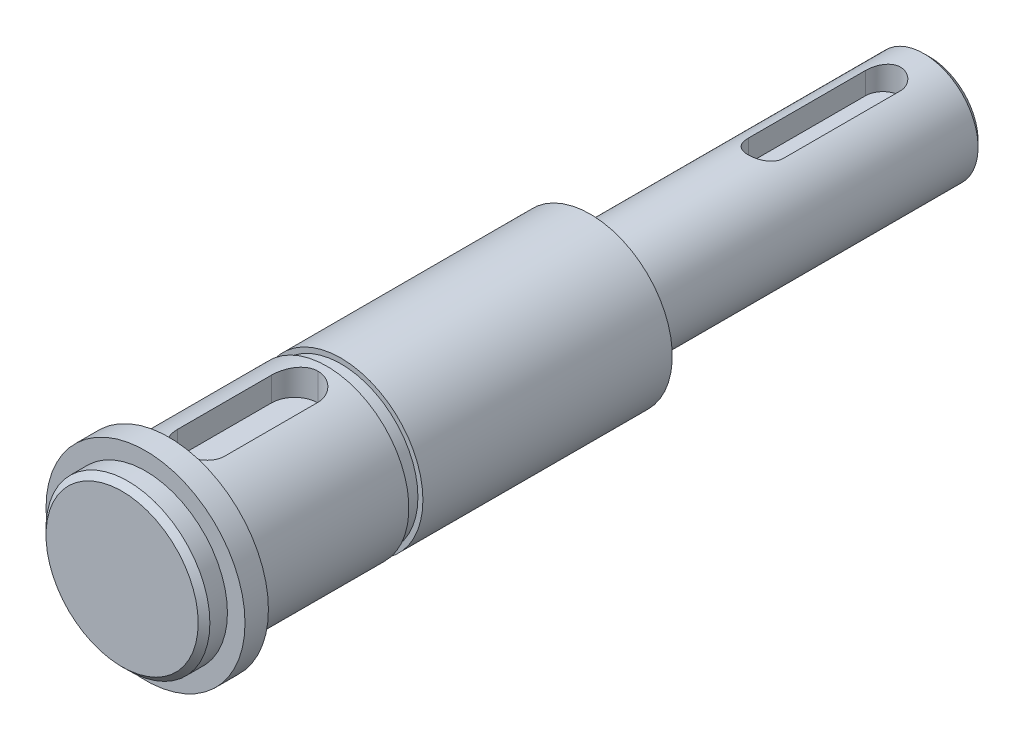
ISO-10303-21;
HEADER;
FILE_DESCRIPTION(('STEP AP214'),'2;1');
FILE_NAME('part.step','',(''),(''),'','','');
FILE_SCHEMA(('AUTOMOTIVE_DESIGN { 1 0 10303 214 1 1 1 1 }'));
ENDSEC;
DATA;
#1=APPLICATION_CONTEXT('core data for automotive mechanical design processes');
#2=APPLICATION_PROTOCOL_DEFINITION('international standard','automotive_design',2000,#1);
#3=PRODUCT_CONTEXT('',#1,'mechanical');
#4=PRODUCT('Part','Part','',(#3));
#5=PRODUCT_RELATED_PRODUCT_CATEGORY('part','',(#4));
#6=PRODUCT_DEFINITION_FORMATION('','',#4);
#7=PRODUCT_DEFINITION_CONTEXT('part definition',#1,'design');
#8=PRODUCT_DEFINITION('design','',#6,#7);
#9=PRODUCT_DEFINITION_SHAPE('','',#8);
#10=(LENGTH_UNIT() NAMED_UNIT(*) SI_UNIT(.MILLI.,.METRE.));
#11=(NAMED_UNIT(*) PLANE_ANGLE_UNIT() SI_UNIT($,.RADIAN.));
#12=(NAMED_UNIT(*) SI_UNIT($,.STERADIAN.) SOLID_ANGLE_UNIT());
#13=UNCERTAINTY_MEASURE_WITH_UNIT(LENGTH_MEASURE(1.E-05),#10,'distance_accuracy_value','');
#14=(GEOMETRIC_REPRESENTATION_CONTEXT(3) GLOBAL_UNCERTAINTY_ASSIGNED_CONTEXT((#13)) GLOBAL_UNIT_ASSIGNED_CONTEXT((#10,
#11,#12)) REPRESENTATION_CONTEXT('',''));
#15=CARTESIAN_POINT('',(0.,0.,0.));
#16=DIRECTION('',(0.,0.,1.));
#17=DIRECTION('',(1.,0.,0.));
#18=AXIS2_PLACEMENT_3D('',#15,#16,#17);
#19=CARTESIAN_POINT('',(0.,0.,-72.));
#20=DIRECTION('',(0.,0.,-1.));
#21=DIRECTION('',(-1.,0.,0.));
#22=AXIS2_PLACEMENT_3D('',#19,#20,#21);
#23=CYLINDRICAL_SURFACE('',#22,9.25);
#24=CARTESIAN_POINT('',(0.,0.,-129.));
#25=DIRECTION('',(0.,0.,-1.));
#26=DIRECTION('',(-1.,0.,0.));
#27=AXIS2_PLACEMENT_3D('',#24,#25,#26);
#28=CIRCLE('',#27,9.25);
#29=CARTESIAN_POINT('',(-9.25,0.,-129.));
#30=VERTEX_POINT('',#29);
#31=EDGE_CURVE('E279',#30,#30,#28,.F.);
#32=ORIENTED_EDGE('',*,*,#31,.T.);
#33=EDGE_LOOP('',(#32));
#34=FACE_BOUND('',#33,.T.);
#35=CARTESIAN_POINT('',(0.,0.,-72.));
#36=DIRECTION('',(0.,0.,-1.));
#37=DIRECTION('',(-1.,0.,0.));
#38=AXIS2_PLACEMENT_3D('',#35,#36,#37);
#39=CIRCLE('',#38,9.25);
#40=CARTESIAN_POINT('',(-9.25,0.,-72.));
#41=VERTEX_POINT('',#40);
#42=EDGE_CURVE('E135',#41,#41,#39,.T.);
#43=ORIENTED_EDGE('',*,*,#42,.T.);
#44=EDGE_LOOP('',(#43));
#45=FACE_BOUND('',#44,.T.);
#46=DIRECTION('',(0.,0.,-1.));
#47=VECTOR('',#46,1.);
#48=CARTESIAN_POINT('',(-2.99999999999999,8.75,-72.));
#49=LINE('',#48,#47);
#50=CARTESIAN_POINT('',(-3.,8.75,-102.));
#51=VERTEX_POINT('',#50);
#52=CARTESIAN_POINT('',(-3.,8.75,-122.));
#53=VERTEX_POINT('',#52);
#54=EDGE_CURVE('E58',#51,#53,#49,.T.);
#55=ORIENTED_EDGE('',*,*,#54,.T.);
#56=CARTESIAN_POINT('',(-3.,8.75,-122.));
#57=CARTESIAN_POINT('',(-3.00001064603914,8.74998738318087,-122.081985488388));
#58=CARTESIAN_POINT('',(-2.99663941357687,8.75115198392283,-122.16396388188));
#59=CARTESIAN_POINT('',(-2.98321609601522,8.75574174677567,-122.327287676229));
#60=CARTESIAN_POINT('',(-2.97316572871784,8.75916632764227,-122.408633234405));
#61=CARTESIAN_POINT('',(-2.94650479934562,8.7681694910523,-122.569886506345));
#62=CARTESIAN_POINT('',(-2.9299129094746,8.7737419416858,-122.649797641614));
#63=CARTESIAN_POINT('',(-2.89033684298874,8.78685864098524,-122.807834966268));
#64=CARTESIAN_POINT('',(-2.86735245354886,8.79440295529978,-122.88596109613));
#65=CARTESIAN_POINT('',(-2.78910942315085,8.8196603286256,-123.116778125584));
#66=CARTESIAN_POINT('',(-2.72452255370023,8.8400116071533,-123.266136986969));
#67=CARTESIAN_POINT('',(-2.57251268411809,8.88543387797246,-123.551915134394));
#68=CARTESIAN_POINT('',(-2.48507660937708,8.91050757018822,-123.688326950848));
#69=CARTESIAN_POINT('',(-2.2863897259887,8.9635831465424,-123.94941090532));
#70=CARTESIAN_POINT('',(-2.17444127219825,8.99165484526716,-124.073539025568));
#71=CARTESIAN_POINT('',(-1.93139892024592,9.04697249501885,-124.301626836327));
#72=CARTESIAN_POINT('',(-1.80030167229007,9.07421830055912,-124.405582990631));
#73=CARTESIAN_POINT('',(-1.51870540582056,9.12562242526545,-124.592837571217));
#74=CARTESIAN_POINT('',(-1.36780899056789,9.1496884927851,-124.675566005042));
#75=CARTESIAN_POINT('',(-1.05333489691852,9.19119649985878,-124.814248407804));
#76=CARTESIAN_POINT('',(-0.889760938434231,9.20864037373764,-124.87021019645));
#77=CARTESIAN_POINT('',(-0.560310334697045,9.23444300548374,-124.951930809957));
#78=CARTESIAN_POINT('',(-0.394688692266203,9.24308310957314,-124.978627173755));
#79=CARTESIAN_POINT('',(-0.0611031895520834,9.25130127521595,-125.004035591862));
#80=CARTESIAN_POINT('',(0.106860136438437,9.25088137120278,-125.002753928663));
#81=CARTESIAN_POINT('',(0.433735632232409,9.24121943359688,-124.972845935019));
#82=CARTESIAN_POINT('',(0.592752212310534,9.23230579961941,-124.945237469513));
#83=CARTESIAN_POINT('',(0.903757260455687,9.20706673314156,-124.865137681779));
#84=CARTESIAN_POINT('',(1.0557453428059,9.19074089439753,-124.812644995704));
#85=CARTESIAN_POINT('',(1.35066185941496,9.15208354689473,-124.683645454368));
#86=CARTESIAN_POINT('',(1.49344973066419,9.12967797082481,-124.60684034735));
#87=CARTESIAN_POINT('',(1.76441679515636,9.08120629438589,-124.431642133417));
#88=CARTESIAN_POINT('',(1.89259218634671,9.0551392452505,-124.333243427407));
#89=CARTESIAN_POINT('',(2.1367498105426,9.00073055671791,-124.112479640763));
#90=CARTESIAN_POINT('',(2.25193261579879,8.9723393235412,-123.989240971863));
#91=CARTESIAN_POINT('',(2.46026176566445,8.91746850535697,-123.724951286129));
#92=CARTESIAN_POINT('',(2.55340121916271,8.89098951994213,-123.58389472021));
#93=CARTESIAN_POINT('',(2.71607372822399,8.84266877234739,-123.285362516377));
#94=CARTESIAN_POINT('',(2.78527461089672,8.8208937238963,-123.127692615847));
#95=CARTESIAN_POINT('',(2.86816854221355,8.79414167919324,-122.883749462039));
#96=CARTESIAN_POINT('',(2.89231295965165,8.78621026484969,-122.801210017017));
#97=CARTESIAN_POINT('',(2.93345702936636,8.77255973856322,-122.634200742222));
#98=CARTESIAN_POINT('',(2.95045995286061,8.76683961381744,-122.549731815));
#99=CARTESIAN_POINT('',(2.97584110533728,8.75825542649653,-122.38783213584));
#100=CARTESIAN_POINT('',(2.9848988348786,8.75516720040972,-122.31051854789));
#101=CARTESIAN_POINT('',(2.99697814133517,8.75103592678231,-122.15547267636));
#102=CARTESIAN_POINT('',(3.00000784981102,8.7499901241289,-122.077741098846));
#103=CARTESIAN_POINT('',(3.,8.75,-122.));
#104=B_SPLINE_CURVE_WITH_KNOTS('',3,(#56,#57,#58,#59,#60,#61,#62,#63,#64,#65,#66,#67,#68,#69,
#70,#71,#72,#73,#74,#75,#76,#77,#78,#79,#80,#81,#82,#83,#84,#85,#86,#87,#88,#89,#90,#91,#92,#93,
#94,#95,#96,#97,#98,#99,#100,#101,#102,#103),.UNSPECIFIED.,.F.,.F.,(4,2,2,2,2,2,2,2,2,2,2,2,2,2,
2,2,2,2,2,2,2,2,2,4),(0.,0.245866897540807,0.491670585206091,0.736777669242226,
0.981892914588718,1.4714334338179,1.96125469015316,2.46742979664977,2.97369355716503,
3.49238983848766,4.01093449324136,4.51233228252208,5.01361748362456,5.496275524058,
5.97896002091647,6.46781161234199,6.9567901102069,7.46759053136845,7.97855042676549,
8.49634001607234,8.75514687203685,9.0138350498512,9.24729007377515,9.48042996206578),.UNSPECIFIED.);
#105=CARTESIAN_POINT('',(3.,8.75,-122.));
#106=VERTEX_POINT('',#105);
#107=EDGE_CURVE('E12',#53,#106,#104,.T.);
#108=ORIENTED_EDGE('',*,*,#107,.T.);
#109=DIRECTION('',(0.,0.,-1.));
#110=VECTOR('',#109,1.);
#111=CARTESIAN_POINT('',(3.00000000000001,8.75,-72.));
#112=LINE('',#111,#110);
#113=CARTESIAN_POINT('',(3.00000000000001,8.75,-102.));
#114=VERTEX_POINT('',#113);
#115=EDGE_CURVE('E282',#106,#114,#112,.F.);
#116=ORIENTED_EDGE('',*,*,#115,.T.);
#117=CARTESIAN_POINT('',(3.,8.75,-102.));
#118=CARTESIAN_POINT('',(3.00001064603914,8.74998738318087,-101.918014511612));
#119=CARTESIAN_POINT('',(2.99663941357687,8.75115198392283,-101.83603611812));
#120=CARTESIAN_POINT('',(2.98321609601522,8.75574174677567,-101.672712323771));
#121=CARTESIAN_POINT('',(2.97316572871784,8.75916632764227,-101.591366765595));
#122=CARTESIAN_POINT('',(2.94650479934562,8.7681694910523,-101.430113493655));
#123=CARTESIAN_POINT('',(2.9299129094746,8.77374194168581,-101.350202358386));
#124=CARTESIAN_POINT('',(2.89033684298874,8.78685864098524,-101.192165033732));
#125=CARTESIAN_POINT('',(2.86735245354886,8.79440295529978,-101.11403890387));
#126=CARTESIAN_POINT('',(2.78910942315085,8.8196603286256,-100.883221874416));
#127=CARTESIAN_POINT('',(2.72452255370023,8.8400116071533,-100.733863013031));
#128=CARTESIAN_POINT('',(2.57251268411808,8.88543387797246,-100.448084865606));
#129=CARTESIAN_POINT('',(2.48507660937708,8.91050757018822,-100.311673049152));
#130=CARTESIAN_POINT('',(2.28638972598871,8.9635831465424,-100.05058909468));
#131=CARTESIAN_POINT('',(2.17444127219825,8.99165484526716,-99.9264609744317));
#132=CARTESIAN_POINT('',(1.93139892024593,9.04697249501885,-99.6983731636731));
#133=CARTESIAN_POINT('',(1.80030167229008,9.07421830055912,-99.5944170093692));
#134=CARTESIAN_POINT('',(1.51870540582056,9.12562242526545,-99.407162428783));
#135=CARTESIAN_POINT('',(1.36780899056789,9.1496884927851,-99.3244339949582));
#136=CARTESIAN_POINT('',(1.05333489691853,9.19119649985878,-99.1857515921959));
#137=CARTESIAN_POINT('',(0.889760938434239,9.20864037373764,-99.1297898035505));
#138=CARTESIAN_POINT('',(0.560310334697054,9.23444300548374,-99.0480691900426));
#139=CARTESIAN_POINT('',(0.394688692266212,9.24308310957314,-99.0213728262445));
#140=CARTESIAN_POINT('',(0.0611031895520905,9.25130127521595,-98.9959644081377));
#141=CARTESIAN_POINT('',(-0.106860136438431,9.25088137120279,-98.9972460713372));
#142=CARTESIAN_POINT('',(-0.433735632232404,9.24121943359688,-99.0271540649808));
#143=CARTESIAN_POINT('',(-0.59275221231053,9.23230579961941,-99.0547625304869));
#144=CARTESIAN_POINT('',(-0.903757260455683,9.20706673314156,-99.1348623182213));
#145=CARTESIAN_POINT('',(-1.0557453428059,9.19074089439753,-99.1873550042959));
#146=CARTESIAN_POINT('',(-1.35066185941496,9.15208354689473,-99.3163545456322));
#147=CARTESIAN_POINT('',(-1.49344973066418,9.12967797082481,-99.3931596526497));
#148=CARTESIAN_POINT('',(-1.76441679515636,9.08120629438589,-99.5683578665831));
#149=CARTESIAN_POINT('',(-1.89259218634671,9.05513924525051,-99.6667565725928));
#150=CARTESIAN_POINT('',(-2.1367498105426,9.00073055671791,-99.8875203592366));
#151=CARTESIAN_POINT('',(-2.25193261579879,8.9723393235412,-100.010759028137));
#152=CARTESIAN_POINT('',(-2.46026176566445,8.91746850535698,-100.275048713871));
#153=CARTESIAN_POINT('',(-2.55340121916271,8.89098951994213,-100.41610527979));
#154=CARTESIAN_POINT('',(-2.71607372822399,8.84266877234739,-100.714637483623));
#155=CARTESIAN_POINT('',(-2.78527461089672,8.82089372389631,-100.872307384153));
#156=CARTESIAN_POINT('',(-2.86816854221355,8.79414167919324,-101.116250537961));
#157=CARTESIAN_POINT('',(-2.89231295965165,8.78621026484969,-101.198789982983));
#158=CARTESIAN_POINT('',(-2.93345702936636,8.77255973856322,-101.365799257778));
#159=CARTESIAN_POINT('',(-2.9504599528606,8.76683961381744,-101.450268185));
#160=CARTESIAN_POINT('',(-2.97584110533728,8.75825542649653,-101.61216786416));
#161=CARTESIAN_POINT('',(-2.98489883487859,8.75516720040972,-101.68948145211));
#162=CARTESIAN_POINT('',(-2.99697814133517,8.75103592678231,-101.84452732364));
#163=CARTESIAN_POINT('',(-3.00000784981102,8.7499901241289,-101.922258901154));
#164=CARTESIAN_POINT('',(-3.,8.75,-102.));
#165=B_SPLINE_CURVE_WITH_KNOTS('',3,(#117,#118,#119,#120,#121,#122,#123,#124,#125,#126,#127,
#128,#129,#130,#131,#132,#133,#134,#135,#136,#137,#138,#139,#140,#141,#142,#143,#144,#145,#146,
#147,#148,#149,#150,#151,#152,#153,#154,#155,#156,#157,#158,#159,#160,#161,#162,#163,#164),
.UNSPECIFIED.,.F.,.F.,(4,2,2,2,2,2,2,2,2,2,2,2,2,2,2,2,2,2,2,2,2,2,2,4),(0.,0.245866897540793,
0.491670585206091,0.73677766924224,0.981892914588718,1.4714334338179,1.96125469015316,
2.46742979664976,2.97369355716503,3.49238983848766,4.01093449324135,4.51233228252207,
5.01361748362456,5.49627552405799,5.97896002091646,6.46781161234198,6.9567901102069,
7.46759053136844,7.97855042676548,8.49634001607235,8.75514687203686,9.0138350498512,
9.24729007377515,9.48042996206578),.UNSPECIFIED.);
#166=EDGE_CURVE('E285',#114,#51,#165,.T.);
#167=ORIENTED_EDGE('',*,*,#166,.T.);
#168=EDGE_LOOP('',(#55,#108,#116,#167));
#169=FACE_BOUND('',#168,.T.);
#170=ADVANCED_FACE('F44',(#34,#45,#169),#23,.T.);
#171=CARTESIAN_POINT('',(0.,0.,5.));
#172=DIRECTION('',(0.,0.,-1.));
#173=DIRECTION('',(-1.,0.,0.));
#174=AXIS2_PLACEMENT_3D('',#171,#172,#173);
#175=CYLINDRICAL_SURFACE('',#174,14.);
#176=CARTESIAN_POINT('',(0.,0.,-29.3972904594189));
#177=DIRECTION('',(0.,0.,1.));
#178=DIRECTION('',(1.,0.,0.));
#179=AXIS2_PLACEMENT_3D('',#176,#177,#178);
#180=CIRCLE('',#179,14.);
#181=CARTESIAN_POINT('',(14.,0.,-29.3972904594189));
#182=VERTEX_POINT('',#181);
#183=EDGE_CURVE('E172',#182,#182,#180,.T.);
#184=ORIENTED_EDGE('',*,*,#183,.F.);
#185=EDGE_LOOP('',(#184));
#186=FACE_BOUND('',#185,.T.);
#187=CARTESIAN_POINT('',(0.,0.,-72.));
#188=DIRECTION('',(0.,0.,-1.));
#189=DIRECTION('',(-1.,0.,0.));
#190=AXIS2_PLACEMENT_3D('',#187,#188,#189);
#191=CIRCLE('',#190,14.);
#192=CARTESIAN_POINT('',(-14.,0.,-72.));
#193=VERTEX_POINT('',#192);
#194=EDGE_CURVE('E160',#193,#193,#191,.T.);
#195=ORIENTED_EDGE('',*,*,#194,.F.);
#196=EDGE_LOOP('',(#195));
#197=FACE_BOUND('',#196,.T.);
#198=ADVANCED_FACE('F319',(#186,#197),#175,.T.);
#199=CARTESIAN_POINT('',(0.,0.,6.99999999999997));
#200=DIRECTION('',(0.,0.,1.));
#201=DIRECTION('',(1.,0.,0.));
#202=AXIS2_PLACEMENT_3D('',#199,#200,#201);
#203=CIRCLE('',#202,14.);
#204=CARTESIAN_POINT('',(14.,0.,6.99999999999997));
#205=VERTEX_POINT('',#204);
#206=EDGE_CURVE('E273',#205,#205,#203,.F.);
#207=ORIENTED_EDGE('',*,*,#206,.T.);
#208=EDGE_LOOP('',(#207));
#209=FACE_BOUND('',#208,.T.);
#210=CARTESIAN_POINT('',(0.,0.,4.));
#211=DIRECTION('',(0.,0.,1.));
#212=DIRECTION('',(1.,0.,0.));
#213=AXIS2_PLACEMENT_3D('',#210,#211,#212);
#214=CIRCLE('',#213,14.);
#215=CARTESIAN_POINT('',(14.,0.,4.));
#216=VERTEX_POINT('',#215);
#217=EDGE_CURVE('E175',#216,#216,#214,.T.);
#218=ORIENTED_EDGE('',*,*,#217,.T.);
#219=EDGE_LOOP('',(#218));
#220=FACE_BOUND('',#219,.T.);
#221=ADVANCED_FACE('F228',(#209,#220),#175,.T.);
#222=CARTESIAN_POINT('',(4.,13.4164078649987,-5.5));
#223=CARTESIAN_POINT('',(4.0000134374781,13.4163934321272,-5.38995934456167));
#224=CARTESIAN_POINT('',(3.99545938644264,13.4177613570237,-5.27992710311275));
#225=CARTESIAN_POINT('',(3.97732079000552,13.4231547279479,-5.06069723004373));
#226=CARTESIAN_POINT('',(3.96373811828131,13.427179622583,-4.9514994300099));
#227=CARTESIAN_POINT('',(3.92769050614894,13.4377669502034,-4.73497313387337));
#228=CARTESIAN_POINT('',(3.90524721590964,13.4443231971897,-4.62764074225106));
#229=CARTESIAN_POINT('',(3.85169506016457,13.4597628592722,-4.41535988973775));
#230=CARTESIAN_POINT('',(3.82058600188661,13.4686463261376,-4.31041148193524));
#231=CARTESIAN_POINT('',(3.71462838325496,13.4984068881322,-4.00028570569619));
#232=CARTESIAN_POINT('',(3.62710670956421,13.5224074804698,-3.79957411880538));
#233=CARTESIAN_POINT('',(3.42099709777644,13.5760100500548,-3.4156890595443));
#234=CARTESIAN_POINT('',(3.30239555207701,13.6056144792319,-3.23252331730193));
#235=CARTESIAN_POINT('',(3.03385736341641,13.6680341442193,-2.88363304523109));
#236=CARTESIAN_POINT('',(2.8831919001528,13.7009124675883,-2.71847969689321));
#237=CARTESIAN_POINT('',(2.55635384206475,13.7656370459004,-2.41540215531346));
#238=CARTESIAN_POINT('',(2.38017633679532,13.7974831007095,-2.27748321613699));
#239=CARTESIAN_POINT('',(2.00323634464421,13.8572760629292,-2.03030407964719));
#240=CARTESIAN_POINT('',(1.80207241215168,13.8851379798946,-1.92163427305161));
#241=CARTESIAN_POINT('',(1.38345521230697,13.9330649446853,-1.73994533215183));
#242=CARTESIAN_POINT('',(1.16601575821841,13.9531365167592,-1.66689635295853));
#243=CARTESIAN_POINT('',(0.789575858579065,13.9785714355868,-1.57549140475047));
#244=CARTESIAN_POINT('',(0.633085965451191,13.9865571355139,-1.54723502893622));
#245=CARTESIAN_POINT('',(0.317760614673369,13.9972933950756,-1.50947278730329));
#246=CARTESIAN_POINT('',(0.158926275370483,14.0000463743578,-1.49995825504724));
#247=CARTESIAN_POINT('',(0.,14.,-1.5));
#248=B_SPLINE_CURVE_WITH_KNOTS('',3,(#222,#223,#224,#225,#226,#227,#228,#229,#230,#231,#232,
#233,#234,#235,#236,#237,#238,#239,#240,#241,#242,#243,#244,#245,#246,#247),.UNSPECIFIED.,.F.,
.F.,(4,2,2,2,2,2,2,2,2,2,2,2,4),(0.,0.330004889848952,0.659941316332419,0.989076511597484,
1.31821902914261,1.97574105328547,2.63355144060492,3.30831561740276,3.9832098428786,
4.67084909752221,5.35791121984491,5.83443142768569,6.31073123549609),.UNSPECIFIED.);
#249=CARTESIAN_POINT('',(4.,13.4164078649987,-5.5));
#250=VERTEX_POINT('',#249);
#251=CARTESIAN_POINT('',(0.,14.,-1.5));
#252=VERTEX_POINT('',#251);
#253=EDGE_CURVE('E213',#250,#252,#248,.T.);
#254=ORIENTED_EDGE('',*,*,#253,.T.);
#255=CARTESIAN_POINT('',(0.,14.,-1.5));
#256=CARTESIAN_POINT('',(-0.110133457837796,14.0000122879939,-1.49998678094628));
#257=CARTESIAN_POINT('',(-0.220259025566232,13.9987007062499,-1.50454829655744));
#258=CARTESIAN_POINT('',(-0.439680884404344,13.9935210588999,-1.52271821199076));
#259=CARTESIAN_POINT('',(-0.548977325708559,13.9896534680637,-1.53632493170095));
#260=CARTESIAN_POINT('',(-0.765719670965627,13.979464712363,-1.57244120651024));
#261=CARTESIAN_POINT('',(-0.873169249438837,13.9731492046936,-1.59493023663404));
#262=CARTESIAN_POINT('',(-1.0856861560804,13.9582468488763,-1.64859598330072));
#263=CARTESIAN_POINT('',(-1.19075344400664,13.949659962391,-1.67977284648214));
#264=CARTESIAN_POINT('',(-1.50125367832883,13.9208208089066,-1.7859763033518));
#265=CARTESIAN_POINT('',(-1.70221721606197,13.8974784095358,-1.87371484984227));
#266=CARTESIAN_POINT('',(-2.0865218073031,13.8450062796287,-2.08033193664849));
#267=CARTESIAN_POINT('',(-2.26985622084846,13.8158743810639,-2.19922214784183));
#268=CARTESIAN_POINT('',(-2.6185708687664,13.7540965552476,-2.46806080179577));
#269=CARTESIAN_POINT('',(-2.78342863308856,13.7213841929149,-2.61867278506014));
#270=CARTESIAN_POINT('',(-3.08593204931604,13.6565376659012,-2.94528038028296));
#271=CARTESIAN_POINT('',(-3.22357097118191,13.6244036460001,-3.12128225150141));
#272=CARTESIAN_POINT('',(-3.47043697755912,13.5636500942346,-3.49804678108026));
#273=CARTESIAN_POINT('',(-3.5790273273352,13.535115610036,-3.69924123883628));
#274=CARTESIAN_POINT('',(-3.76055754481759,13.4858113503487,-4.11791505503061));
#275=CARTESIAN_POINT('',(-3.83352944731137,13.4650346016179,-4.33537957657168));
#276=CARTESIAN_POINT('',(-3.92473628372501,13.4386748953873,-4.71161209676566));
#277=CARTESIAN_POINT('',(-3.95290477030514,13.430383956879,-4.86785227594823));
#278=CARTESIAN_POINT('',(-3.99055440862911,13.4192241683275,-5.18269724121636));
#279=CARTESIAN_POINT('',(-4.0000422916816,13.4163533652254,-5.34130115479694));
#280=CARTESIAN_POINT('',(-4.,13.4164078649987,-5.5));
#281=B_SPLINE_CURVE_WITH_KNOTS('',3,(#255,#256,#257,#258,#259,#260,#261,#262,#263,#264,#265,
#266,#267,#268,#269,#270,#271,#272,#273,#274,#275,#276,#277,#278,#279,#280),.UNSPECIFIED.,.F.,
.F.,(4,2,2,2,2,2,2,2,2,2,2,2,4),(0.,0.330284589448136,0.66050784693576,0.989972457453349,
1.31944262921197,1.97768454748985,2.63617342761382,3.31011945579538,3.98423191382648,
4.6720933624685,5.35933501191986,5.83511832365932,6.31073016176927),.UNSPECIFIED.);
#282=CARTESIAN_POINT('',(-4.,13.4164078649987,-5.5));
#283=VERTEX_POINT('',#282);
#284=EDGE_CURVE('E221',#252,#283,#281,.T.);
#285=ORIENTED_EDGE('',*,*,#284,.T.);
#286=DIRECTION('',(0.,0.,-1.));
#287=VECTOR('',#286,1.);
#288=CARTESIAN_POINT('',(-4.,13.4164078649987,5.));
#289=LINE('',#288,#287);
#290=CARTESIAN_POINT('',(-4.,13.4164078649987,-21.5));
#291=VERTEX_POINT('',#290);
#292=EDGE_CURVE('E189',#291,#283,#289,.F.);
#293=ORIENTED_EDGE('',*,*,#292,.F.);
#294=CARTESIAN_POINT('',(-4.,13.4164078649987,-21.5));
#295=CARTESIAN_POINT('',(-4.0000134374781,13.4163934321272,-21.6100406554383));
#296=CARTESIAN_POINT('',(-3.99545938644264,13.4177613570237,-21.7200728968872));
#297=CARTESIAN_POINT('',(-3.97732079000552,13.4231547279479,-21.9393027699563));
#298=CARTESIAN_POINT('',(-3.96373811828131,13.427179622583,-22.0485005699901));
#299=CARTESIAN_POINT('',(-3.92769050614894,13.4377669502034,-22.2650268661266));
#300=CARTESIAN_POINT('',(-3.90524721590965,13.4443231971897,-22.3723592577489));
#301=CARTESIAN_POINT('',(-3.85169506016458,13.4597628592722,-22.5846401102622));
#302=CARTESIAN_POINT('',(-3.82058600188662,13.4686463261376,-22.6895885180648));
#303=CARTESIAN_POINT('',(-3.71462838325496,13.4984068881322,-22.9997142943038));
#304=CARTESIAN_POINT('',(-3.62710670956421,13.5224074804698,-23.2004258811946));
#305=CARTESIAN_POINT('',(-3.42099709777644,13.5760100500548,-23.5843109404557));
#306=CARTESIAN_POINT('',(-3.30239555207701,13.6056144792319,-23.7674766826981));
#307=CARTESIAN_POINT('',(-3.03385736341641,13.6680341442193,-24.1163669547689));
#308=CARTESIAN_POINT('',(-2.8831919001528,13.7009124675883,-24.2815203031068));
#309=CARTESIAN_POINT('',(-2.55635384206476,13.7656370459004,-24.5845978446865));
#310=CARTESIAN_POINT('',(-2.38017633679533,13.7974831007095,-24.722516783863));
#311=CARTESIAN_POINT('',(-2.00323634464422,13.8572760629292,-24.9696959203528));
#312=CARTESIAN_POINT('',(-1.80207241215169,13.8851379798946,-25.0783657269484));
#313=CARTESIAN_POINT('',(-1.38345521230697,13.9330649446853,-25.2600546678482));
#314=CARTESIAN_POINT('',(-1.16601575821841,13.9531365167592,-25.3331036470415));
#315=CARTESIAN_POINT('',(-0.78957585857907,13.9785714355868,-25.4245085952495));
#316=CARTESIAN_POINT('',(-0.633085965451196,13.9865571355139,-25.4527649710638));
#317=CARTESIAN_POINT('',(-0.317760614673374,13.9972933950756,-25.4905272126967));
#318=CARTESIAN_POINT('',(-0.158926275370488,14.0000463743578,-25.5000417449528));
#319=CARTESIAN_POINT('',(0.,14.,-25.5));
#320=B_SPLINE_CURVE_WITH_KNOTS('',3,(#294,#295,#296,#297,#298,#299,#300,#301,#302,#303,#304,
#305,#306,#307,#308,#309,#310,#311,#312,#313,#314,#315,#316,#317,#318,#319),.UNSPECIFIED.,.F.,
.F.,(4,2,2,2,2,2,2,2,2,2,2,2,4),(0.,0.330004889848953,0.659941316332419,0.989076511597483,
1.31821902914261,1.97574105328546,2.63355144060492,3.30831561740276,3.9832098428786,
4.67084909752221,5.3579112198449,5.83443142768569,6.31073123549609),.UNSPECIFIED.);
#321=CARTESIAN_POINT('',(0.,14.,-25.5));
#322=VERTEX_POINT('',#321);
#323=EDGE_CURVE('E73',#291,#322,#320,.T.);
#324=ORIENTED_EDGE('',*,*,#323,.T.);
#325=CARTESIAN_POINT('',(0.,14.,-25.5));
#326=CARTESIAN_POINT('',(0.110133457837793,14.0000122879939,-25.5000132190537));
#327=CARTESIAN_POINT('',(0.220259025566228,13.9987007062499,-25.4954517034426));
#328=CARTESIAN_POINT('',(0.439680884404341,13.9935210588999,-25.4772817880092));
#329=CARTESIAN_POINT('',(0.548977325708556,13.9896534680637,-25.4636750682991));
#330=CARTESIAN_POINT('',(0.765719670965624,13.979464712363,-25.4275587934898));
#331=CARTESIAN_POINT('',(0.873169249438832,13.9731492046936,-25.405069763366));
#332=CARTESIAN_POINT('',(1.0856861560804,13.9582468488763,-25.3514040166993));
#333=CARTESIAN_POINT('',(1.19075344400664,13.949659962391,-25.3202271535179));
#334=CARTESIAN_POINT('',(1.50125367832883,13.9208208089066,-25.2140236966482));
#335=CARTESIAN_POINT('',(1.70221721606197,13.8974784095358,-25.1262851501577));
#336=CARTESIAN_POINT('',(2.0865218073031,13.8450062796287,-24.9196680633515));
#337=CARTESIAN_POINT('',(2.26985622084845,13.8158743810639,-24.8007778521582));
#338=CARTESIAN_POINT('',(2.6185708687664,13.7540965552476,-24.5319391982042));
#339=CARTESIAN_POINT('',(2.78342863308855,13.7213841929149,-24.3813272149399));
#340=CARTESIAN_POINT('',(3.08593204931604,13.6565376659012,-24.054719619717));
#341=CARTESIAN_POINT('',(3.22357097118191,13.6244036460001,-23.8787177484986));
#342=CARTESIAN_POINT('',(3.47043697755912,13.5636500942346,-23.5019532189197));
#343=CARTESIAN_POINT('',(3.5790273273352,13.535115610036,-23.3007587611637));
#344=CARTESIAN_POINT('',(3.76055754481759,13.4858113503487,-22.8820849449694));
#345=CARTESIAN_POINT('',(3.83352944731136,13.4650346016179,-22.6646204234283));
#346=CARTESIAN_POINT('',(3.924736283725,13.4386748953873,-22.2883879032343));
#347=CARTESIAN_POINT('',(3.95290477030514,13.430383956879,-22.1321477240518));
#348=CARTESIAN_POINT('',(3.99055440862911,13.4192241683275,-21.8173027587836));
#349=CARTESIAN_POINT('',(4.0000422916816,13.4163533652254,-21.6586988452031));
#350=CARTESIAN_POINT('',(4.,13.4164078649987,-21.5));
#351=B_SPLINE_CURVE_WITH_KNOTS('',3,(#325,#326,#327,#328,#329,#330,#331,#332,#333,#334,#335,
#336,#337,#338,#339,#340,#341,#342,#343,#344,#345,#346,#347,#348,#349,#350),.UNSPECIFIED.,.F.,
.F.,(4,2,2,2,2,2,2,2,2,2,2,2,4),(0.,0.330284589448136,0.660507846935759,0.989972457453348,
1.31944262921197,1.97768454748985,2.63617342761382,3.31011945579538,3.98423191382648,
4.67209336246851,5.35933501191986,5.83511832365932,6.31073016176927),.UNSPECIFIED.);
#352=CARTESIAN_POINT('',(4.,13.4164078649987,-21.5));
#353=VERTEX_POINT('',#352);
#354=EDGE_CURVE('E254',#322,#353,#351,.T.);
#355=ORIENTED_EDGE('',*,*,#354,.T.);
#356=DIRECTION('',(0.,0.,-1.));
#357=VECTOR('',#356,1.);
#358=CARTESIAN_POINT('',(4.,13.4164078649987,5.));
#359=LINE('',#358,#357);
#360=EDGE_CURVE('E192',#250,#353,#359,.T.);
#361=ORIENTED_EDGE('',*,*,#360,.F.);
#362=EDGE_LOOP('',(#254,#285,#293,#324,#355,#361));
#363=FACE_BOUND('',#362,.T.);
#364=CARTESIAN_POINT('',(0.,0.,0.));
#365=DIRECTION('',(0.,0.,1.));
#366=DIRECTION('',(1.,0.,0.));
#367=AXIS2_PLACEMENT_3D('',#364,#365,#366);
#368=CIRCLE('',#367,14.);
#369=CARTESIAN_POINT('',(14.,0.,0.));
#370=VERTEX_POINT('',#369);
#371=EDGE_CURVE('E178',#370,#370,#368,.T.);
#372=ORIENTED_EDGE('',*,*,#371,.F.);
#373=EDGE_LOOP('',(#372));
#374=FACE_BOUND('',#373,.T.);
#375=CARTESIAN_POINT('',(0.,0.,-26.9972904594189));
#376=DIRECTION('',(0.,0.,-1.));
#377=DIRECTION('',(-1.,0.,0.));
#378=AXIS2_PLACEMENT_3D('',#375,#376,#377);
#379=CIRCLE('',#378,14.);
#380=CARTESIAN_POINT('',(-14.,0.,-26.9972904594189));
#381=VERTEX_POINT('',#380);
#382=EDGE_CURVE('E167',#381,#381,#379,.T.);
#383=ORIENTED_EDGE('',*,*,#382,.F.);
#384=EDGE_LOOP('',(#383));
#385=FACE_BOUND('',#384,.T.);
#386=ADVANCED_FACE('F325',(#363,#374,#385),#175,.T.);
#387=CARTESIAN_POINT('',(4.,9.3,-25.5));
#388=DIRECTION('',(-1.,0.,0.));
#389=DIRECTION('',(0.,0.,1.));
#390=AXIS2_PLACEMENT_3D('',#387,#388,#389);
#391=PLANE('',#390);
#392=DIRECTION('',(0.,0.,1.));
#393=VECTOR('',#392,1.);
#394=CARTESIAN_POINT('',(4.,9.3,-25.5));
#395=LINE('',#394,#393);
#396=CARTESIAN_POINT('',(4.,9.3,-21.5));
#397=VERTEX_POINT('',#396);
#398=CARTESIAN_POINT('',(4.,9.3,-5.5));
#399=VERTEX_POINT('',#398);
#400=EDGE_CURVE('E182',#397,#399,#395,.T.);
#401=ORIENTED_EDGE('',*,*,#400,.T.);
#402=DIRECTION('',(0.,1.,0.));
#403=VECTOR('',#402,1.);
#404=CARTESIAN_POINT('',(4.,13.4164078649987,-5.5));
#405=LINE('',#404,#403);
#406=EDGE_CURVE('E197',#399,#250,#405,.T.);
#407=ORIENTED_EDGE('',*,*,#406,.T.);
#408=ORIENTED_EDGE('',*,*,#360,.T.);
#409=DIRECTION('',(0.,1.,0.));
#410=VECTOR('',#409,1.);
#411=CARTESIAN_POINT('',(4.,9.3,-21.5));
#412=LINE('',#411,#410);
#413=EDGE_CURVE('E195',#353,#397,#412,.F.);
#414=ORIENTED_EDGE('',*,*,#413,.T.);
#415=EDGE_LOOP('',(#401,#407,#408,#414));
#416=FACE_BOUND('',#415,.T.);
#417=ADVANCED_FACE('F492',(#416),#391,.T.);
#418=CARTESIAN_POINT('',(-4.,9.3,-1.5));
#419=DIRECTION('',(1.,0.,0.));
#420=DIRECTION('',(0.,0.,-1.));
#421=AXIS2_PLACEMENT_3D('',#418,#419,#420);
#422=PLANE('',#421);
#423=ORIENTED_EDGE('',*,*,#292,.T.);
#424=DIRECTION('',(0.,1.,0.));
#425=VECTOR('',#424,1.);
#426=CARTESIAN_POINT('',(-4.,9.3,-5.5));
#427=LINE('',#426,#425);
#428=CARTESIAN_POINT('',(-4.,9.3,-5.5));
#429=VERTEX_POINT('',#428);
#430=EDGE_CURVE('E211',#283,#429,#427,.F.);
#431=ORIENTED_EDGE('',*,*,#430,.T.);
#432=DIRECTION('',(0.,0.,-1.));
#433=VECTOR('',#432,1.);
#434=CARTESIAN_POINT('',(-4.,9.3,-1.5));
#435=LINE('',#434,#433);
#436=CARTESIAN_POINT('',(-4.,9.3,-21.5));
#437=VERTEX_POINT('',#436);
#438=EDGE_CURVE('E185',#429,#437,#435,.T.);
#439=ORIENTED_EDGE('',*,*,#438,.T.);
#440=DIRECTION('',(0.,1.,0.));
#441=VECTOR('',#440,1.);
#442=CARTESIAN_POINT('',(-4.,13.4164078649987,-21.5));
#443=LINE('',#442,#441);
#444=EDGE_CURVE('E208',#437,#291,#443,.T.);
#445=ORIENTED_EDGE('',*,*,#444,.T.);
#446=EDGE_LOOP('',(#423,#431,#439,#445));
#447=FACE_BOUND('',#446,.T.);
#448=ADVANCED_FACE('F482',(#447),#422,.T.);
#449=CARTESIAN_POINT('',(0.,9.3,0.));
#450=DIRECTION('',(0.,-1.,0.));
#451=DIRECTION('',(0.,0.,-1.));
#452=AXIS2_PLACEMENT_3D('',#449,#450,#451);
#453=PLANE('',#452);
#454=CARTESIAN_POINT('',(0.,9.3,-5.5));
#455=DIRECTION('',(0.,-1.,0.));
#456=DIRECTION('',(0.,0.,-1.));
#457=AXIS2_PLACEMENT_3D('',#454,#455,#456);
#458=CIRCLE('',#457,4.);
#459=CARTESIAN_POINT('',(0.,9.3,-1.5));
#460=VERTEX_POINT('',#459);
#461=EDGE_CURVE('E204',#429,#460,#458,.F.);
#462=ORIENTED_EDGE('',*,*,#461,.T.);
#463=CARTESIAN_POINT('',(0.,9.3,-5.5));
#464=DIRECTION('',(0.,-1.,0.));
#465=DIRECTION('',(0.,0.,-1.));
#466=AXIS2_PLACEMENT_3D('',#463,#464,#465);
#467=CIRCLE('',#466,4.);
#468=EDGE_CURVE('E206',#460,#399,#467,.F.);
#469=ORIENTED_EDGE('',*,*,#468,.T.);
#470=ORIENTED_EDGE('',*,*,#400,.F.);
#471=CARTESIAN_POINT('',(0.,9.3,-21.5));
#472=DIRECTION('',(0.,-1.,0.));
#473=DIRECTION('',(0.,0.,-1.));
#474=AXIS2_PLACEMENT_3D('',#471,#472,#473);
#475=CIRCLE('',#474,4.);
#476=CARTESIAN_POINT('',(0.,9.3,-25.5));
#477=VERTEX_POINT('',#476);
#478=EDGE_CURVE('E200',#397,#477,#475,.F.);
#479=ORIENTED_EDGE('',*,*,#478,.T.);
#480=CARTESIAN_POINT('',(0.,9.3,-21.5));
#481=DIRECTION('',(0.,-1.,0.));
#482=DIRECTION('',(0.,0.,-1.));
#483=AXIS2_PLACEMENT_3D('',#480,#481,#482);
#484=CIRCLE('',#483,4.);
#485=EDGE_CURVE('E202',#477,#437,#484,.F.);
#486=ORIENTED_EDGE('',*,*,#485,.T.);
#487=ORIENTED_EDGE('',*,*,#438,.F.);
#488=EDGE_LOOP('',(#462,#469,#470,#479,#486,#487));
#489=FACE_BOUND('',#488,.T.);
#490=ADVANCED_FACE('F240',(#489),#453,.F.);
#491=CARTESIAN_POINT('',(0.,9.3,-5.5));
#492=DIRECTION('',(0.,-1.,0.));
#493=DIRECTION('',(0.,0.,-1.));
#494=AXIS2_PLACEMENT_3D('',#491,#492,#493);
#495=CYLINDRICAL_SURFACE('',#494,4.);
#496=DIRECTION('',(0.,1.,0.));
#497=VECTOR('',#496,1.);
#498=CARTESIAN_POINT('',(0.,13.4164078649987,-1.5));
#499=LINE('',#498,#497);
#500=EDGE_CURVE('E186',#460,#252,#499,.T.);
#501=ORIENTED_EDGE('',*,*,#500,.F.);
#502=ORIENTED_EDGE('',*,*,#461,.F.);
#503=ORIENTED_EDGE('',*,*,#430,.F.);
#504=ORIENTED_EDGE('',*,*,#284,.F.);
#505=EDGE_LOOP('',(#501,#502,#503,#504));
#506=FACE_BOUND('',#505,.T.);
#507=ADVANCED_FACE('F235',(#506),#495,.F.);
#508=CARTESIAN_POINT('',(0.,9.3,-5.5));
#509=DIRECTION('',(0.,-1.,0.));
#510=DIRECTION('',(0.,0.,-1.));
#511=AXIS2_PLACEMENT_3D('',#508,#509,#510);
#512=CYLINDRICAL_SURFACE('',#511,4.);
#513=ORIENTED_EDGE('',*,*,#468,.F.);
#514=ORIENTED_EDGE('',*,*,#500,.T.);
#515=ORIENTED_EDGE('',*,*,#253,.F.);
#516=ORIENTED_EDGE('',*,*,#406,.F.);
#517=EDGE_LOOP('',(#513,#514,#515,#516));
#518=FACE_BOUND('',#517,.T.);
#519=ADVANCED_FACE('F231',(#518),#512,.F.);
#520=CARTESIAN_POINT('',(0.,9.3,-21.5));
#521=DIRECTION('',(0.,-1.,0.));
#522=DIRECTION('',(0.,0.,-1.));
#523=AXIS2_PLACEMENT_3D('',#520,#521,#522);
#524=CYLINDRICAL_SURFACE('',#523,4.);
#525=DIRECTION('',(0.,1.,0.));
#526=VECTOR('',#525,1.);
#527=CARTESIAN_POINT('',(0.,13.4164078649987,-25.5));
#528=LINE('',#527,#526);
#529=EDGE_CURVE('E181',#477,#322,#528,.T.);
#530=ORIENTED_EDGE('',*,*,#529,.F.);
#531=ORIENTED_EDGE('',*,*,#478,.F.);
#532=ORIENTED_EDGE('',*,*,#413,.F.);
#533=ORIENTED_EDGE('',*,*,#354,.F.);
#534=EDGE_LOOP('',(#530,#531,#532,#533));
#535=FACE_BOUND('',#534,.T.);
#536=ADVANCED_FACE('F234',(#535),#524,.F.);
#537=CARTESIAN_POINT('',(0.,9.3,-21.5));
#538=DIRECTION('',(0.,-1.,0.));
#539=DIRECTION('',(0.,0.,-1.));
#540=AXIS2_PLACEMENT_3D('',#537,#538,#539);
#541=CYLINDRICAL_SURFACE('',#540,4.);
#542=ORIENTED_EDGE('',*,*,#485,.F.);
#543=ORIENTED_EDGE('',*,*,#529,.T.);
#544=ORIENTED_EDGE('',*,*,#323,.F.);
#545=ORIENTED_EDGE('',*,*,#444,.F.);
#546=EDGE_LOOP('',(#542,#543,#544,#545));
#547=FACE_BOUND('',#546,.T.);
#548=ADVANCED_FACE('F242',(#547),#541,.F.);
#549=CARTESIAN_POINT('',(0.,-17.,0.));
#550=DIRECTION('',(0.,0.,-1.));
#551=DIRECTION('',(-1.,0.,0.));
#552=AXIS2_PLACEMENT_3D('',#549,#550,#551);
#553=PLANE('',#552);
#554=ORIENTED_EDGE('',*,*,#371,.T.);
#555=EDGE_LOOP('',(#554));
#556=FACE_BOUND('',#555,.T.);
#557=CARTESIAN_POINT('',(0.,0.,0.));
#558=DIRECTION('',(0.,0.,1.));
#559=DIRECTION('',(1.,0.,0.));
#560=AXIS2_PLACEMENT_3D('',#557,#558,#559);
#561=CIRCLE('',#560,17.);
#562=CARTESIAN_POINT('',(17.,0.,0.));
#563=VERTEX_POINT('',#562);
#564=EDGE_CURVE('E168',#563,#563,#561,.T.);
#565=ORIENTED_EDGE('',*,*,#564,.F.);
#566=EDGE_LOOP('',(#565));
#567=FACE_BOUND('',#566,.T.);
#568=ADVANCED_FACE('F246',(#556,#567),#553,.T.);
#569=CARTESIAN_POINT('',(0.,-17.,4.));
#570=DIRECTION('',(0.,0.,1.));
#571=DIRECTION('',(1.,0.,0.));
#572=AXIS2_PLACEMENT_3D('',#569,#570,#571);
#573=PLANE('',#572);
#574=CARTESIAN_POINT('',(0.,0.,4.));
#575=DIRECTION('',(0.,0.,1.));
#576=DIRECTION('',(1.,0.,0.));
#577=AXIS2_PLACEMENT_3D('',#574,#575,#576);
#578=CIRCLE('',#577,17.);
#579=CARTESIAN_POINT('',(17.,0.,4.));
#580=VERTEX_POINT('',#579);
#581=EDGE_CURVE('E171',#580,#580,#578,.T.);
#582=ORIENTED_EDGE('',*,*,#581,.T.);
#583=EDGE_LOOP('',(#582));
#584=FACE_BOUND('',#583,.T.);
#585=ORIENTED_EDGE('',*,*,#217,.F.);
#586=EDGE_LOOP('',(#585));
#587=FACE_BOUND('',#586,.T.);
#588=ADVANCED_FACE('F428',(#584,#587),#573,.T.);
#589=CARTESIAN_POINT('',(0.,0.,0.));
#590=DIRECTION('',(0.,0.,1.));
#591=DIRECTION('',(1.,0.,0.));
#592=AXIS2_PLACEMENT_3D('',#589,#590,#591);
#593=CYLINDRICAL_SURFACE('',#592,17.);
#594=ORIENTED_EDGE('',*,*,#564,.T.);
#595=EDGE_LOOP('',(#594));
#596=FACE_BOUND('',#595,.T.);
#597=ORIENTED_EDGE('',*,*,#581,.F.);
#598=EDGE_LOOP('',(#597));
#599=FACE_BOUND('',#598,.T.);
#600=ADVANCED_FACE('F417',(#596,#599),#593,.T.);
#601=CARTESIAN_POINT('',(-20.,0.,-29.3972904594189));
#602=DIRECTION('',(0.,0.,1.));
#603=DIRECTION('',(1.,0.,0.));
#604=AXIS2_PLACEMENT_3D('',#601,#602,#603);
#605=PLANE('',#604);
#606=CARTESIAN_POINT('',(0.,0.,-29.3972904594189));
#607=DIRECTION('',(0.,0.,1.));
#608=DIRECTION('',(1.,0.,0.));
#609=AXIS2_PLACEMENT_3D('',#606,#607,#608);
#610=CIRCLE('',#609,13.1499999999991);
#611=CARTESIAN_POINT('',(13.1499999999991,0.,-29.3972904594189));
#612=VERTEX_POINT('',#611);
#613=EDGE_CURVE('E164',#612,#612,#610,.T.);
#614=ORIENTED_EDGE('',*,*,#613,.F.);
#615=EDGE_LOOP('',(#614));
#616=FACE_BOUND('',#615,.T.);
#617=ORIENTED_EDGE('',*,*,#183,.T.);
#618=EDGE_LOOP('',(#617));
#619=FACE_BOUND('',#618,.T.);
#620=ADVANCED_FACE('F407',(#616,#619),#605,.T.);
#621=CARTESIAN_POINT('',(-13.1499999999991,0.,-26.9972904594189));
#622=DIRECTION('',(0.,0.,-1.));
#623=DIRECTION('',(-1.,0.,0.));
#624=AXIS2_PLACEMENT_3D('',#621,#622,#623);
#625=PLANE('',#624);
#626=CARTESIAN_POINT('',(0.,0.,-26.9972904594189));
#627=DIRECTION('',(0.,0.,1.));
#628=DIRECTION('',(1.,0.,0.));
#629=AXIS2_PLACEMENT_3D('',#626,#627,#628);
#630=CIRCLE('',#629,13.1499999999991);
#631=CARTESIAN_POINT('',(13.1499999999991,0.,-26.9972904594189));
#632=VERTEX_POINT('',#631);
#633=EDGE_CURVE('E161',#632,#632,#630,.T.);
#634=ORIENTED_EDGE('',*,*,#633,.T.);
#635=EDGE_LOOP('',(#634));
#636=FACE_BOUND('',#635,.T.);
#637=ORIENTED_EDGE('',*,*,#382,.T.);
#638=EDGE_LOOP('',(#637));
#639=FACE_BOUND('',#638,.T.);
#640=ADVANCED_FACE('F397',(#636,#639),#625,.T.);
#641=CARTESIAN_POINT('',(0.,0.,0.));
#642=DIRECTION('',(0.,0.,1.));
#643=DIRECTION('',(1.,0.,0.));
#644=AXIS2_PLACEMENT_3D('',#641,#642,#643);
#645=CYLINDRICAL_SURFACE('',#644,13.1499999999991);
#646=ORIENTED_EDGE('',*,*,#613,.T.);
#647=EDGE_LOOP('',(#646));
#648=FACE_BOUND('',#647,.T.);
#649=ORIENTED_EDGE('',*,*,#633,.F.);
#650=EDGE_LOOP('',(#649));
#651=FACE_BOUND('',#650,.T.);
#652=ADVANCED_FACE('F392',(#648,#651),#645,.T.);
#653=CARTESIAN_POINT('',(0.,0.,8.));
#654=DIRECTION('',(0.,0.,1.));
#655=DIRECTION('',(1.,0.,0.));
#656=AXIS2_PLACEMENT_3D('',#653,#654,#655);
#657=PLANE('',#656);
#658=CARTESIAN_POINT('',(0.,0.,8.));
#659=DIRECTION('',(0.,0.,1.));
#660=DIRECTION('',(1.,0.,0.));
#661=AXIS2_PLACEMENT_3D('',#658,#659,#660);
#662=CIRCLE('',#661,13.);
#663=CARTESIAN_POINT('',(13.,0.,8.));
#664=VERTEX_POINT('',#663);
#665=EDGE_CURVE('E260',#664,#664,#662,.T.);
#666=ORIENTED_EDGE('',*,*,#665,.T.);
#667=EDGE_LOOP('',(#666));
#668=FACE_BOUND('',#667,.T.);
#669=ADVANCED_FACE('F316',(#668),#657,.T.);
#670=CARTESIAN_POINT('',(0.,0.,-72.));
#671=DIRECTION('',(0.,0.,-1.));
#672=DIRECTION('',(-1.,0.,0.));
#673=AXIS2_PLACEMENT_3D('',#670,#671,#672);
#674=PLANE('',#673);
#675=ORIENTED_EDGE('',*,*,#42,.F.);
#676=EDGE_LOOP('',(#675));
#677=FACE_BOUND('',#676,.T.);
#678=ORIENTED_EDGE('',*,*,#194,.T.);
#679=EDGE_LOOP('',(#678));
#680=FACE_BOUND('',#679,.T.);
#681=ADVANCED_FACE('F309',(#677,#680),#674,.T.);
#682=CARTESIAN_POINT('',(0.,0.,-130.));
#683=DIRECTION('',(0.,0.,-1.));
#684=DIRECTION('',(-1.,0.,0.));
#685=AXIS2_PLACEMENT_3D('',#682,#683,#684);
#686=PLANE('',#685);
#687=CARTESIAN_POINT('',(0.,0.,-130.));
#688=DIRECTION('',(0.,0.,-1.));
#689=DIRECTION('',(-1.,0.,0.));
#690=AXIS2_PLACEMENT_3D('',#687,#688,#689);
#691=CIRCLE('',#690,8.24999999999999);
#692=CARTESIAN_POINT('',(-8.24999999999999,0.,-130.));
#693=VERTEX_POINT('',#692);
#694=EDGE_CURVE('E276',#693,#693,#691,.T.);
#695=ORIENTED_EDGE('',*,*,#694,.T.);
#696=EDGE_LOOP('',(#695));
#697=FACE_BOUND('',#696,.T.);
#698=ADVANCED_FACE('F306',(#697),#686,.T.);
#699=CARTESIAN_POINT('',(0.,0.,8.));
#700=DIRECTION('',(0.,0.,-1.));
#701=DIRECTION('',(-1.,0.,0.));
#702=AXIS2_PLACEMENT_3D('',#699,#700,#701);
#703=CONICAL_SURFACE('',#702,13.,0.785398163397445);
#704=ORIENTED_EDGE('',*,*,#206,.F.);
#705=EDGE_LOOP('',(#704));
#706=FACE_BOUND('',#705,.T.);
#707=ORIENTED_EDGE('',*,*,#665,.F.);
#708=EDGE_LOOP('',(#707));
#709=FACE_BOUND('',#708,.T.);
#710=ADVANCED_FACE('F308',(#706,#709),#703,.T.);
#711=CARTESIAN_POINT('',(0.,0.,-130.));
#712=DIRECTION('',(0.,0.,1.));
#713=DIRECTION('',(1.,0.,0.));
#714=AXIS2_PLACEMENT_3D('',#711,#712,#713);
#715=CONICAL_SURFACE('',#714,8.24999999999999,0.785398163397451);
#716=ORIENTED_EDGE('',*,*,#31,.F.);
#717=EDGE_LOOP('',(#716));
#718=FACE_BOUND('',#717,.T.);
#719=ORIENTED_EDGE('',*,*,#694,.F.);
#720=EDGE_LOOP('',(#719));
#721=FACE_BOUND('',#720,.T.);
#722=ADVANCED_FACE('F46',(#718,#721),#715,.T.);
#723=CARTESIAN_POINT('',(0.,15.,-122.));
#724=DIRECTION('',(0.,-1.,0.));
#725=DIRECTION('',(0.,0.,-1.));
#726=AXIS2_PLACEMENT_3D('',#723,#724,#725);
#727=CYLINDRICAL_SURFACE('',#726,3.);
#728=DIRECTION('',(0.,-1.,0.));
#729=VECTOR('',#728,1.);
#730=CARTESIAN_POINT('',(-3.,15.,-122.));
#731=LINE('',#730,#729);
#732=CARTESIAN_POINT('',(-3.,5.,-122.));
#733=VERTEX_POINT('',#732);
#734=EDGE_CURVE('E127',#53,#733,#731,.T.);
#735=ORIENTED_EDGE('',*,*,#734,.T.);
#736=CARTESIAN_POINT('',(0.,5.,-122.));
#737=DIRECTION('',(0.,1.,0.));
#738=DIRECTION('',(0.,0.,1.));
#739=AXIS2_PLACEMENT_3D('',#736,#737,#738);
#740=CIRCLE('',#739,3.);
#741=CARTESIAN_POINT('',(3.,5.,-122.));
#742=VERTEX_POINT('',#741);
#743=EDGE_CURVE('E132',#742,#733,#740,.T.);
#744=ORIENTED_EDGE('',*,*,#743,.F.);
#745=DIRECTION('',(0.,-1.,0.));
#746=VECTOR('',#745,1.);
#747=CARTESIAN_POINT('',(3.,15.,-122.));
#748=LINE('',#747,#746);
#749=EDGE_CURVE('E154',#106,#742,#748,.T.);
#750=ORIENTED_EDGE('',*,*,#749,.F.);
#751=ORIENTED_EDGE('',*,*,#107,.F.);
#752=EDGE_LOOP('',(#735,#744,#750,#751));
#753=FACE_BOUND('',#752,.T.);
#754=ADVANCED_FACE('F129',(#753),#727,.F.);
#755=CARTESIAN_POINT('',(-3.,15.,-122.));
#756=DIRECTION('',(1.,0.,0.));
#757=DIRECTION('',(0.,0.,-1.));
#758=AXIS2_PLACEMENT_3D('',#755,#756,#757);
#759=PLANE('',#758);
#760=DIRECTION('',(0.,-1.,0.));
#761=VECTOR('',#760,1.);
#762=CARTESIAN_POINT('',(-3.,15.,-102.));
#763=LINE('',#762,#761);
#764=CARTESIAN_POINT('',(-3.,5.,-102.));
#765=VERTEX_POINT('',#764);
#766=EDGE_CURVE('E136',#51,#765,#763,.T.);
#767=ORIENTED_EDGE('',*,*,#766,.T.);
#768=DIRECTION('',(0.,0.,1.));
#769=VECTOR('',#768,1.);
#770=CARTESIAN_POINT('',(-3.,5.,-122.));
#771=LINE('',#770,#769);
#772=EDGE_CURVE('E139',#733,#765,#771,.T.);
#773=ORIENTED_EDGE('',*,*,#772,.F.);
#774=ORIENTED_EDGE('',*,*,#734,.F.);
#775=ORIENTED_EDGE('',*,*,#54,.F.);
#776=EDGE_LOOP('',(#767,#773,#774,#775));
#777=FACE_BOUND('',#776,.T.);
#778=ADVANCED_FACE('F140',(#777),#759,.T.);
#779=CARTESIAN_POINT('',(0.,15.,-102.));
#780=DIRECTION('',(0.,-1.,0.));
#781=DIRECTION('',(0.,0.,-1.));
#782=AXIS2_PLACEMENT_3D('',#779,#780,#781);
#783=CYLINDRICAL_SURFACE('',#782,3.);
#784=DIRECTION('',(0.,-1.,0.));
#785=VECTOR('',#784,1.);
#786=CARTESIAN_POINT('',(3.,15.,-102.));
#787=LINE('',#786,#785);
#788=CARTESIAN_POINT('',(3.,5.,-102.));
#789=VERTEX_POINT('',#788);
#790=EDGE_CURVE('E65',#114,#789,#787,.T.);
#791=ORIENTED_EDGE('',*,*,#790,.T.);
#792=CARTESIAN_POINT('',(0.,5.,-102.));
#793=DIRECTION('',(0.,1.,0.));
#794=DIRECTION('',(0.,0.,1.));
#795=AXIS2_PLACEMENT_3D('',#792,#793,#794);
#796=CIRCLE('',#795,3.);
#797=EDGE_CURVE('E145',#765,#789,#796,.T.);
#798=ORIENTED_EDGE('',*,*,#797,.F.);
#799=ORIENTED_EDGE('',*,*,#766,.F.);
#800=ORIENTED_EDGE('',*,*,#166,.F.);
#801=EDGE_LOOP('',(#791,#798,#799,#800));
#802=FACE_BOUND('',#801,.T.);
#803=ADVANCED_FACE('F295',(#802),#783,.F.);
#804=CARTESIAN_POINT('',(3.,15.,-122.));
#805=DIRECTION('',(-1.,0.,0.));
#806=DIRECTION('',(0.,0.,1.));
#807=AXIS2_PLACEMENT_3D('',#804,#805,#806);
#808=PLANE('',#807);
#809=ORIENTED_EDGE('',*,*,#749,.T.);
#810=DIRECTION('',(0.,0.,-1.));
#811=VECTOR('',#810,1.);
#812=CARTESIAN_POINT('',(3.,5.,-122.));
#813=LINE('',#812,#811);
#814=EDGE_CURVE('E149',#789,#742,#813,.T.);
#815=ORIENTED_EDGE('',*,*,#814,.F.);
#816=ORIENTED_EDGE('',*,*,#790,.F.);
#817=ORIENTED_EDGE('',*,*,#115,.F.);
#818=EDGE_LOOP('',(#809,#815,#816,#817));
#819=FACE_BOUND('',#818,.T.);
#820=ADVANCED_FACE('F300',(#819),#808,.T.);
#821=CARTESIAN_POINT('',(0.,5.,-122.));
#822=DIRECTION('',(0.,1.,0.));
#823=DIRECTION('',(0.,0.,1.));
#824=AXIS2_PLACEMENT_3D('',#821,#822,#823);
#825=PLANE('',#824);
#826=ORIENTED_EDGE('',*,*,#743,.T.);
#827=ORIENTED_EDGE('',*,*,#772,.T.);
#828=ORIENTED_EDGE('',*,*,#797,.T.);
#829=ORIENTED_EDGE('',*,*,#814,.T.);
#830=EDGE_LOOP('',(#826,#827,#828,#829));
#831=FACE_BOUND('',#830,.T.);
#832=ADVANCED_FACE('F148',(#831),#825,.T.);
#833=CLOSED_SHELL('',(#170,#198,#221,#386,#417,#448,#490,#507,#519,#536,#548,#568,#588,#600,
#620,#640,#652,#669,#681,#698,#710,#722,#754,#778,#803,#820,#832));
#834=MANIFOLD_SOLID_BREP('B2',#833);
#835=ADVANCED_BREP_SHAPE_REPRESENTATION('',(#18,#834),#14);
#836=SHAPE_DEFINITION_REPRESENTATION(#9,#835);
ENDSEC;
END-ISO-10303-21;
